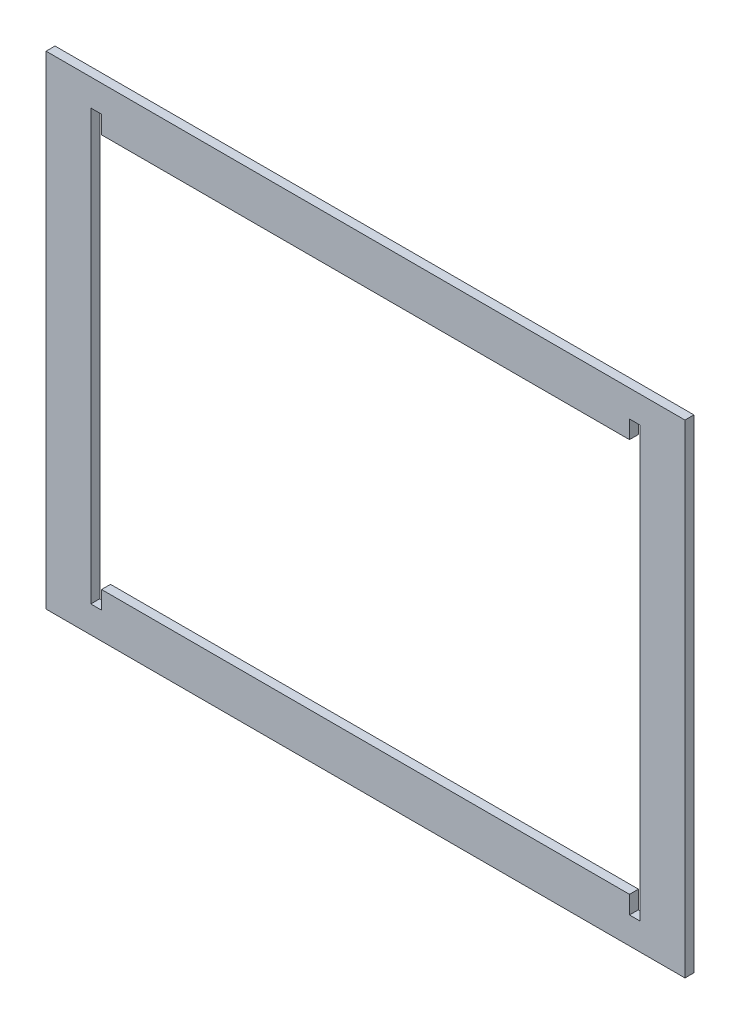
ISO-10303-21;
HEADER;
FILE_DESCRIPTION(('STEP AP214'),'2;1');
FILE_NAME('part.step','',(''),(''),'','','');
FILE_SCHEMA(('AUTOMOTIVE_DESIGN { 1 0 10303 214 1 1 1 1 }'));
ENDSEC;
DATA;
#1=APPLICATION_CONTEXT('core data for automotive mechanical design processes');
#2=APPLICATION_PROTOCOL_DEFINITION('international standard','automotive_design',2000,#1);
#3=PRODUCT_CONTEXT('',#1,'mechanical');
#4=PRODUCT('Part','Part','',(#3));
#5=PRODUCT_RELATED_PRODUCT_CATEGORY('part','',(#4));
#6=PRODUCT_DEFINITION_FORMATION('','',#4);
#7=PRODUCT_DEFINITION_CONTEXT('part definition',#1,'design');
#8=PRODUCT_DEFINITION('design','',#6,#7);
#9=PRODUCT_DEFINITION_SHAPE('','',#8);
#10=(LENGTH_UNIT() NAMED_UNIT(*) SI_UNIT(.MILLI.,.METRE.));
#11=(NAMED_UNIT(*) PLANE_ANGLE_UNIT() SI_UNIT($,.RADIAN.));
#12=(NAMED_UNIT(*) SI_UNIT($,.STERADIAN.) SOLID_ANGLE_UNIT());
#13=UNCERTAINTY_MEASURE_WITH_UNIT(LENGTH_MEASURE(1.E-05),#10,'distance_accuracy_value','');
#14=(GEOMETRIC_REPRESENTATION_CONTEXT(3) GLOBAL_UNCERTAINTY_ASSIGNED_CONTEXT((#13)) GLOBAL_UNIT_ASSIGNED_CONTEXT((#10,
#11,#12)) REPRESENTATION_CONTEXT('',''));
#15=CARTESIAN_POINT('',(0.,0.,0.));
#16=DIRECTION('',(0.,0.,1.));
#17=DIRECTION('',(1.,0.,0.));
#18=AXIS2_PLACEMENT_3D('',#15,#16,#17);
#19=CARTESIAN_POINT('',(178.5,135.,5.));
#20=DIRECTION('',(0.,0.,-1.));
#21=DIRECTION('',(-1.,0.,0.));
#22=AXIS2_PLACEMENT_3D('',#19,#20,#21);
#23=PLANE('',#22);
#24=DIRECTION('',(0.,1.,0.));
#25=VECTOR('',#24,1.);
#26=CARTESIAN_POINT('',(178.5,-135.,5.));
#27=LINE('',#26,#25);
#28=CARTESIAN_POINT('',(178.5,-135.,5.));
#29=VERTEX_POINT('',#28);
#30=CARTESIAN_POINT('',(178.5,135.,5.));
#31=VERTEX_POINT('',#30);
#32=EDGE_CURVE('E257',#29,#31,#27,.T.);
#33=ORIENTED_EDGE('',*,*,#32,.T.);
#34=DIRECTION('',(-1.,0.,0.));
#35=VECTOR('',#34,1.);
#36=CARTESIAN_POINT('',(-178.5,135.,5.));
#37=LINE('',#36,#35);
#38=CARTESIAN_POINT('',(-178.5,135.,5.));
#39=VERTEX_POINT('',#38);
#40=EDGE_CURVE('E83',#31,#39,#37,.T.);
#41=ORIENTED_EDGE('',*,*,#40,.T.);
#42=DIRECTION('',(0.,-1.,0.));
#43=VECTOR('',#42,1.);
#44=CARTESIAN_POINT('',(-178.5,-135.,5.));
#45=LINE('',#44,#43);
#46=CARTESIAN_POINT('',(-178.5,-135.,5.));
#47=VERTEX_POINT('',#46);
#48=EDGE_CURVE('E260',#39,#47,#45,.T.);
#49=ORIENTED_EDGE('',*,*,#48,.T.);
#50=DIRECTION('',(1.,0.,0.));
#51=VECTOR('',#50,1.);
#52=CARTESIAN_POINT('',(-178.5,-135.,5.));
#53=LINE('',#52,#51);
#54=EDGE_CURVE('E55',#47,#29,#53,.T.);
#55=ORIENTED_EDGE('',*,*,#54,.T.);
#56=EDGE_LOOP('',(#33,#41,#49,#55));
#57=FACE_BOUND('',#56,.T.);
#58=DIRECTION('',(1.,0.,0.));
#59=VECTOR('',#58,1.);
#60=CARTESIAN_POINT('',(-153.5,-120.,5.));
#61=LINE('',#60,#59);
#62=CARTESIAN_POINT('',(-153.5,-120.,5.));
#63=VERTEX_POINT('',#62);
#64=CARTESIAN_POINT('',(-147.5,-120.,5.));
#65=VERTEX_POINT('',#64);
#66=EDGE_CURVE('E183',#63,#65,#61,.T.);
#67=ORIENTED_EDGE('',*,*,#66,.F.);
#68=DIRECTION('',(0.,-1.,0.));
#69=VECTOR('',#68,1.);
#70=CARTESIAN_POINT('',(-153.5,-110.,5.));
#71=LINE('',#70,#69);
#72=CARTESIAN_POINT('',(-153.5,120.,5.));
#73=VERTEX_POINT('',#72);
#74=EDGE_CURVE('E172',#73,#63,#71,.T.);
#75=ORIENTED_EDGE('',*,*,#74,.F.);
#76=DIRECTION('',(-1.,0.,0.));
#77=VECTOR('',#76,1.);
#78=CARTESIAN_POINT('',(-153.5,120.,5.));
#79=LINE('',#78,#77);
#80=CARTESIAN_POINT('',(-147.5,120.,5.));
#81=VERTEX_POINT('',#80);
#82=EDGE_CURVE('E232',#81,#73,#79,.T.);
#83=ORIENTED_EDGE('',*,*,#82,.F.);
#84=DIRECTION('',(0.,1.,0.));
#85=VECTOR('',#84,1.);
#86=CARTESIAN_POINT('',(-147.5,110.,5.));
#87=LINE('',#86,#85);
#88=CARTESIAN_POINT('',(-147.5,110.,5.));
#89=VERTEX_POINT('',#88);
#90=EDGE_CURVE('E224',#89,#81,#87,.T.);
#91=ORIENTED_EDGE('',*,*,#90,.F.);
#92=DIRECTION('',(-1.,0.,0.));
#93=VECTOR('',#92,1.);
#94=CARTESIAN_POINT('',(-153.5,110.,5.));
#95=LINE('',#94,#93);
#96=CARTESIAN_POINT('',(147.5,110.,5.));
#97=VERTEX_POINT('',#96);
#98=EDGE_CURVE('E248',#97,#89,#95,.T.);
#99=ORIENTED_EDGE('',*,*,#98,.F.);
#100=DIRECTION('',(0.,-1.,0.));
#101=VECTOR('',#100,1.);
#102=CARTESIAN_POINT('',(147.5,110.,5.));
#103=LINE('',#102,#101);
#104=CARTESIAN_POINT('',(147.5,120.,5.));
#105=VERTEX_POINT('',#104);
#106=EDGE_CURVE('E206',#105,#97,#103,.T.);
#107=ORIENTED_EDGE('',*,*,#106,.F.);
#108=DIRECTION('',(-1.,0.,0.));
#109=VECTOR('',#108,1.);
#110=CARTESIAN_POINT('',(147.5,120.,5.));
#111=LINE('',#110,#109);
#112=CARTESIAN_POINT('',(153.5,120.,5.));
#113=VERTEX_POINT('',#112);
#114=EDGE_CURVE('E215',#113,#105,#111,.T.);
#115=ORIENTED_EDGE('',*,*,#114,.F.);
#116=DIRECTION('',(0.,1.,0.));
#117=VECTOR('',#116,1.);
#118=CARTESIAN_POINT('',(153.5,-110.,5.));
#119=LINE('',#118,#117);
#120=CARTESIAN_POINT('',(153.5,-120.,5.));
#121=VERTEX_POINT('',#120);
#122=EDGE_CURVE('E246',#121,#113,#119,.T.);
#123=ORIENTED_EDGE('',*,*,#122,.F.);
#124=DIRECTION('',(1.,0.,0.));
#125=VECTOR('',#124,1.);
#126=CARTESIAN_POINT('',(147.5,-120.,5.));
#127=LINE('',#126,#125);
#128=CARTESIAN_POINT('',(147.5,-120.,5.));
#129=VERTEX_POINT('',#128);
#130=EDGE_CURVE('E195',#129,#121,#127,.T.);
#131=ORIENTED_EDGE('',*,*,#130,.F.);
#132=DIRECTION('',(0.,-1.,0.));
#133=VECTOR('',#132,1.);
#134=CARTESIAN_POINT('',(147.5,-110.,5.));
#135=LINE('',#134,#133);
#136=CARTESIAN_POINT('',(147.5,-110.,5.));
#137=VERTEX_POINT('',#136);
#138=EDGE_CURVE('E189',#137,#129,#135,.T.);
#139=ORIENTED_EDGE('',*,*,#138,.F.);
#140=DIRECTION('',(1.,0.,0.));
#141=VECTOR('',#140,1.);
#142=CARTESIAN_POINT('',(-153.5,-110.,5.));
#143=LINE('',#142,#141);
#144=CARTESIAN_POINT('',(-147.5,-110.,5.));
#145=VERTEX_POINT('',#144);
#146=EDGE_CURVE('E251',#145,#137,#143,.T.);
#147=ORIENTED_EDGE('',*,*,#146,.F.);
#148=DIRECTION('',(0.,1.,0.));
#149=VECTOR('',#148,1.);
#150=CARTESIAN_POINT('',(-147.5,-110.,5.));
#151=LINE('',#150,#149);
#152=EDGE_CURVE('E46',#65,#145,#151,.T.);
#153=ORIENTED_EDGE('',*,*,#152,.F.);
#154=EDGE_LOOP('',(#67,#75,#83,#91,#99,#107,#115,#123,#131,#139,#147,#153));
#155=FACE_BOUND('',#154,.T.);
#156=ADVANCED_FACE('F31',(#57,#155),#23,.F.);
#157=CARTESIAN_POINT('',(178.5,135.,0.));
#158=DIRECTION('',(0.,0.,-1.));
#159=DIRECTION('',(-1.,0.,0.));
#160=AXIS2_PLACEMENT_3D('',#157,#158,#159);
#161=PLANE('',#160);
#162=DIRECTION('',(0.,-1.,0.));
#163=VECTOR('',#162,1.);
#164=CARTESIAN_POINT('',(-153.5,-110.,0.));
#165=LINE('',#164,#163);
#166=CARTESIAN_POINT('',(-153.5,120.,0.));
#167=VERTEX_POINT('',#166);
#168=CARTESIAN_POINT('',(-153.5,-120.,0.));
#169=VERTEX_POINT('',#168);
#170=EDGE_CURVE('E153',#167,#169,#165,.T.);
#171=ORIENTED_EDGE('',*,*,#170,.T.);
#172=DIRECTION('',(1.,0.,0.));
#173=VECTOR('',#172,1.);
#174=CARTESIAN_POINT('',(-153.5,-120.,0.));
#175=LINE('',#174,#173);
#176=CARTESIAN_POINT('',(-147.5,-120.,0.));
#177=VERTEX_POINT('',#176);
#178=EDGE_CURVE('E159',#169,#177,#175,.T.);
#179=ORIENTED_EDGE('',*,*,#178,.T.);
#180=DIRECTION('',(0.,1.,0.));
#181=VECTOR('',#180,1.);
#182=CARTESIAN_POINT('',(-147.5,-110.,0.));
#183=LINE('',#182,#181);
#184=CARTESIAN_POINT('',(-147.5,-110.,0.));
#185=VERTEX_POINT('',#184);
#186=EDGE_CURVE('E177',#177,#185,#183,.T.);
#187=ORIENTED_EDGE('',*,*,#186,.T.);
#188=DIRECTION('',(1.,0.,0.));
#189=VECTOR('',#188,1.);
#190=CARTESIAN_POINT('',(-153.5,-110.,0.));
#191=LINE('',#190,#189);
#192=CARTESIAN_POINT('',(147.5,-110.,0.));
#193=VERTEX_POINT('',#192);
#194=EDGE_CURVE('E166',#185,#193,#191,.T.);
#195=ORIENTED_EDGE('',*,*,#194,.T.);
#196=DIRECTION('',(0.,-1.,0.));
#197=VECTOR('',#196,1.);
#198=CARTESIAN_POINT('',(147.5,-110.,0.));
#199=LINE('',#198,#197);
#200=CARTESIAN_POINT('',(147.5,-120.,0.));
#201=VERTEX_POINT('',#200);
#202=EDGE_CURVE('E191',#193,#201,#199,.T.);
#203=ORIENTED_EDGE('',*,*,#202,.T.);
#204=DIRECTION('',(1.,0.,0.));
#205=VECTOR('',#204,1.);
#206=CARTESIAN_POINT('',(147.5,-120.,0.));
#207=LINE('',#206,#205);
#208=CARTESIAN_POINT('',(153.5,-120.,0.));
#209=VERTEX_POINT('',#208);
#210=EDGE_CURVE('E194',#201,#209,#207,.T.);
#211=ORIENTED_EDGE('',*,*,#210,.T.);
#212=DIRECTION('',(0.,1.,0.));
#213=VECTOR('',#212,1.);
#214=CARTESIAN_POINT('',(153.5,-110.,0.));
#215=LINE('',#214,#213);
#216=CARTESIAN_POINT('',(153.5,120.,0.));
#217=VERTEX_POINT('',#216);
#218=EDGE_CURVE('E241',#209,#217,#215,.T.);
#219=ORIENTED_EDGE('',*,*,#218,.T.);
#220=DIRECTION('',(-1.,0.,0.));
#221=VECTOR('',#220,1.);
#222=CARTESIAN_POINT('',(147.5,120.,0.));
#223=LINE('',#222,#221);
#224=CARTESIAN_POINT('',(147.5,120.,0.));
#225=VERTEX_POINT('',#224);
#226=EDGE_CURVE('E214',#217,#225,#223,.T.);
#227=ORIENTED_EDGE('',*,*,#226,.T.);
#228=DIRECTION('',(0.,-1.,0.));
#229=VECTOR('',#228,1.);
#230=CARTESIAN_POINT('',(147.5,110.,0.));
#231=LINE('',#230,#229);
#232=CARTESIAN_POINT('',(147.5,110.,0.));
#233=VERTEX_POINT('',#232);
#234=EDGE_CURVE('E211',#225,#233,#231,.T.);
#235=ORIENTED_EDGE('',*,*,#234,.T.);
#236=DIRECTION('',(-1.,0.,0.));
#237=VECTOR('',#236,1.);
#238=CARTESIAN_POINT('',(-153.5,110.,0.));
#239=LINE('',#238,#237);
#240=CARTESIAN_POINT('',(-147.5,110.,0.));
#241=VERTEX_POINT('',#240);
#242=EDGE_CURVE('E167',#233,#241,#239,.T.);
#243=ORIENTED_EDGE('',*,*,#242,.T.);
#244=DIRECTION('',(0.,1.,0.));
#245=VECTOR('',#244,1.);
#246=CARTESIAN_POINT('',(-147.5,110.,0.));
#247=LINE('',#246,#245);
#248=CARTESIAN_POINT('',(-147.5,120.,0.));
#249=VERTEX_POINT('',#248);
#250=EDGE_CURVE('E230',#241,#249,#247,.T.);
#251=ORIENTED_EDGE('',*,*,#250,.T.);
#252=DIRECTION('',(-1.,0.,0.));
#253=VECTOR('',#252,1.);
#254=CARTESIAN_POINT('',(-153.5,120.,0.));
#255=LINE('',#254,#253);
#256=EDGE_CURVE('E162',#249,#167,#255,.T.);
#257=ORIENTED_EDGE('',*,*,#256,.T.);
#258=EDGE_LOOP('',(#171,#179,#187,#195,#203,#211,#219,#227,#235,#243,#251,#257));
#259=FACE_BOUND('',#258,.T.);
#260=DIRECTION('',(0.,1.,0.));
#261=VECTOR('',#260,1.);
#262=CARTESIAN_POINT('',(178.5,-135.,0.));
#263=LINE('',#262,#261);
#264=CARTESIAN_POINT('',(178.5,-135.,0.));
#265=VERTEX_POINT('',#264);
#266=CARTESIAN_POINT('',(178.5,135.,0.));
#267=VERTEX_POINT('',#266);
#268=EDGE_CURVE('E253',#265,#267,#263,.T.);
#269=ORIENTED_EDGE('',*,*,#268,.F.);
#270=DIRECTION('',(1.,0.,0.));
#271=VECTOR('',#270,1.);
#272=CARTESIAN_POINT('',(-178.5,-135.,0.));
#273=LINE('',#272,#271);
#274=CARTESIAN_POINT('',(-178.5,-135.,0.));
#275=VERTEX_POINT('',#274);
#276=EDGE_CURVE('E76',#275,#265,#273,.T.);
#277=ORIENTED_EDGE('',*,*,#276,.F.);
#278=DIRECTION('',(0.,-1.,0.));
#279=VECTOR('',#278,1.);
#280=CARTESIAN_POINT('',(-178.5,-135.,0.));
#281=LINE('',#280,#279);
#282=CARTESIAN_POINT('',(-178.5,135.,0.));
#283=VERTEX_POINT('',#282);
#284=EDGE_CURVE('E268',#283,#275,#281,.T.);
#285=ORIENTED_EDGE('',*,*,#284,.F.);
#286=DIRECTION('',(-1.,0.,0.));
#287=VECTOR('',#286,1.);
#288=CARTESIAN_POINT('',(-178.5,135.,0.));
#289=LINE('',#288,#287);
#290=EDGE_CURVE('E266',#267,#283,#289,.T.);
#291=ORIENTED_EDGE('',*,*,#290,.F.);
#292=EDGE_LOOP('',(#269,#277,#285,#291));
#293=FACE_BOUND('',#292,.T.);
#294=ADVANCED_FACE('F155',(#259,#293),#161,.T.);
#295=CARTESIAN_POINT('',(178.5,-135.,5.));
#296=DIRECTION('',(-1.,0.,0.));
#297=DIRECTION('',(0.,0.,1.));
#298=AXIS2_PLACEMENT_3D('',#295,#296,#297);
#299=PLANE('',#298);
#300=ORIENTED_EDGE('',*,*,#268,.T.);
#301=DIRECTION('',(0.,0.,-1.));
#302=VECTOR('',#301,1.);
#303=CARTESIAN_POINT('',(178.5,135.,5.));
#304=LINE('',#303,#302);
#305=EDGE_CURVE('E11',#31,#267,#304,.T.);
#306=ORIENTED_EDGE('',*,*,#305,.F.);
#307=ORIENTED_EDGE('',*,*,#32,.F.);
#308=DIRECTION('',(0.,0.,-1.));
#309=VECTOR('',#308,1.);
#310=CARTESIAN_POINT('',(178.5,-135.,5.));
#311=LINE('',#310,#309);
#312=EDGE_CURVE('E263',#29,#265,#311,.T.);
#313=ORIENTED_EDGE('',*,*,#312,.T.);
#314=EDGE_LOOP('',(#300,#306,#307,#313));
#315=FACE_BOUND('',#314,.T.);
#316=ADVANCED_FACE('F33',(#315),#299,.F.);
#317=CARTESIAN_POINT('',(-178.5,135.,5.));
#318=DIRECTION('',(0.,-1.,0.));
#319=DIRECTION('',(0.,0.,-1.));
#320=AXIS2_PLACEMENT_3D('',#317,#318,#319);
#321=PLANE('',#320);
#322=ORIENTED_EDGE('',*,*,#290,.T.);
#323=DIRECTION('',(0.,0.,-1.));
#324=VECTOR('',#323,1.);
#325=CARTESIAN_POINT('',(-178.5,135.,5.));
#326=LINE('',#325,#324);
#327=EDGE_CURVE('E39',#39,#283,#326,.T.);
#328=ORIENTED_EDGE('',*,*,#327,.F.);
#329=ORIENTED_EDGE('',*,*,#40,.F.);
#330=ORIENTED_EDGE('',*,*,#305,.T.);
#331=EDGE_LOOP('',(#322,#328,#329,#330));
#332=FACE_BOUND('',#331,.T.);
#333=ADVANCED_FACE('F294',(#332),#321,.F.);
#334=CARTESIAN_POINT('',(-178.5,-135.,5.));
#335=DIRECTION('',(1.,0.,0.));
#336=DIRECTION('',(0.,0.,-1.));
#337=AXIS2_PLACEMENT_3D('',#334,#335,#336);
#338=PLANE('',#337);
#339=ORIENTED_EDGE('',*,*,#284,.T.);
#340=DIRECTION('',(0.,0.,-1.));
#341=VECTOR('',#340,1.);
#342=CARTESIAN_POINT('',(-178.5,-135.,5.));
#343=LINE('',#342,#341);
#344=EDGE_CURVE('E272',#47,#275,#343,.T.);
#345=ORIENTED_EDGE('',*,*,#344,.F.);
#346=ORIENTED_EDGE('',*,*,#48,.F.);
#347=ORIENTED_EDGE('',*,*,#327,.T.);
#348=EDGE_LOOP('',(#339,#345,#346,#347));
#349=FACE_BOUND('',#348,.T.);
#350=ADVANCED_FACE('F277',(#349),#338,.F.);
#351=CARTESIAN_POINT('',(-178.5,-135.,5.));
#352=DIRECTION('',(0.,1.,0.));
#353=DIRECTION('',(0.,0.,1.));
#354=AXIS2_PLACEMENT_3D('',#351,#352,#353);
#355=PLANE('',#354);
#356=ORIENTED_EDGE('',*,*,#276,.T.);
#357=ORIENTED_EDGE('',*,*,#312,.F.);
#358=ORIENTED_EDGE('',*,*,#54,.F.);
#359=ORIENTED_EDGE('',*,*,#344,.T.);
#360=EDGE_LOOP('',(#356,#357,#358,#359));
#361=FACE_BOUND('',#360,.T.);
#362=ADVANCED_FACE('F283',(#361),#355,.F.);
#363=CARTESIAN_POINT('',(153.5,-110.,5.));
#364=DIRECTION('',(-1.,0.,0.));
#365=DIRECTION('',(0.,0.,1.));
#366=AXIS2_PLACEMENT_3D('',#363,#364,#365);
#367=PLANE('',#366);
#368=ORIENTED_EDGE('',*,*,#218,.F.);
#369=DIRECTION('',(0.,0.,1.));
#370=VECTOR('',#369,1.);
#371=CARTESIAN_POINT('',(153.5,-120.,0.));
#372=LINE('',#371,#370);
#373=EDGE_CURVE('E207',#209,#121,#372,.T.);
#374=ORIENTED_EDGE('',*,*,#373,.T.);
#375=ORIENTED_EDGE('',*,*,#122,.T.);
#376=DIRECTION('',(0.,0.,1.));
#377=VECTOR('',#376,1.);
#378=CARTESIAN_POINT('',(153.5,120.,0.));
#379=LINE('',#378,#377);
#380=EDGE_CURVE('E225',#217,#113,#379,.T.);
#381=ORIENTED_EDGE('',*,*,#380,.F.);
#382=EDGE_LOOP('',(#368,#374,#375,#381));
#383=FACE_BOUND('',#382,.T.);
#384=ADVANCED_FACE('F285',(#383),#367,.T.);
#385=CARTESIAN_POINT('',(-153.5,110.,5.));
#386=DIRECTION('',(0.,-1.,0.));
#387=DIRECTION('',(0.,0.,-1.));
#388=AXIS2_PLACEMENT_3D('',#385,#386,#387);
#389=PLANE('',#388);
#390=DIRECTION('',(0.,0.,1.));
#391=VECTOR('',#390,1.);
#392=CARTESIAN_POINT('',(147.5,110.,0.));
#393=LINE('',#392,#391);
#394=EDGE_CURVE('E218',#233,#97,#393,.T.);
#395=ORIENTED_EDGE('',*,*,#394,.T.);
#396=ORIENTED_EDGE('',*,*,#98,.T.);
#397=DIRECTION('',(0.,0.,1.));
#398=VECTOR('',#397,1.);
#399=CARTESIAN_POINT('',(-147.5,110.,0.));
#400=LINE('',#399,#398);
#401=EDGE_CURVE('E234',#241,#89,#400,.T.);
#402=ORIENTED_EDGE('',*,*,#401,.F.);
#403=ORIENTED_EDGE('',*,*,#242,.F.);
#404=EDGE_LOOP('',(#395,#396,#402,#403));
#405=FACE_BOUND('',#404,.T.);
#406=ADVANCED_FACE('F291',(#405),#389,.T.);
#407=CARTESIAN_POINT('',(-153.5,-110.,5.));
#408=DIRECTION('',(1.,0.,0.));
#409=DIRECTION('',(0.,0.,-1.));
#410=AXIS2_PLACEMENT_3D('',#407,#408,#409);
#411=PLANE('',#410);
#412=ORIENTED_EDGE('',*,*,#170,.F.);
#413=DIRECTION('',(0.,0.,1.));
#414=VECTOR('',#413,1.);
#415=CARTESIAN_POINT('',(-153.5,120.,0.));
#416=LINE('',#415,#414);
#417=EDGE_CURVE('E239',#167,#73,#416,.T.);
#418=ORIENTED_EDGE('',*,*,#417,.T.);
#419=ORIENTED_EDGE('',*,*,#74,.T.);
#420=DIRECTION('',(0.,0.,1.));
#421=VECTOR('',#420,1.);
#422=CARTESIAN_POINT('',(-153.5,-120.,0.));
#423=LINE('',#422,#421);
#424=EDGE_CURVE('E170',#169,#63,#423,.T.);
#425=ORIENTED_EDGE('',*,*,#424,.F.);
#426=EDGE_LOOP('',(#412,#418,#419,#425));
#427=FACE_BOUND('',#426,.T.);
#428=ADVANCED_FACE('F171',(#427),#411,.T.);
#429=CARTESIAN_POINT('',(-153.5,-110.,5.));
#430=DIRECTION('',(0.,1.,0.));
#431=DIRECTION('',(0.,0.,1.));
#432=AXIS2_PLACEMENT_3D('',#429,#430,#431);
#433=PLANE('',#432);
#434=DIRECTION('',(0.,0.,1.));
#435=VECTOR('',#434,1.);
#436=CARTESIAN_POINT('',(-147.5,-110.,0.));
#437=LINE('',#436,#435);
#438=EDGE_CURVE('E187',#185,#145,#437,.T.);
#439=ORIENTED_EDGE('',*,*,#438,.T.);
#440=ORIENTED_EDGE('',*,*,#146,.T.);
#441=DIRECTION('',(0.,0.,1.));
#442=VECTOR('',#441,1.);
#443=CARTESIAN_POINT('',(147.5,-110.,0.));
#444=LINE('',#443,#442);
#445=EDGE_CURVE('E203',#193,#137,#444,.T.);
#446=ORIENTED_EDGE('',*,*,#445,.F.);
#447=ORIENTED_EDGE('',*,*,#194,.F.);
#448=EDGE_LOOP('',(#439,#440,#446,#447));
#449=FACE_BOUND('',#448,.T.);
#450=ADVANCED_FACE('F309',(#449),#433,.T.);
#451=CARTESIAN_POINT('',(-153.5,120.,0.));
#452=DIRECTION('',(0.,1.,0.));
#453=DIRECTION('',(0.,0.,1.));
#454=AXIS2_PLACEMENT_3D('',#451,#452,#453);
#455=PLANE('',#454);
#456=ORIENTED_EDGE('',*,*,#82,.T.);
#457=ORIENTED_EDGE('',*,*,#417,.F.);
#458=ORIENTED_EDGE('',*,*,#256,.F.);
#459=DIRECTION('',(0.,0.,1.));
#460=VECTOR('',#459,1.);
#461=CARTESIAN_POINT('',(-147.5,120.,0.));
#462=LINE('',#461,#460);
#463=EDGE_CURVE('E242',#249,#81,#462,.T.);
#464=ORIENTED_EDGE('',*,*,#463,.T.);
#465=EDGE_LOOP('',(#456,#457,#458,#464));
#466=FACE_BOUND('',#465,.T.);
#467=ADVANCED_FACE('F312',(#466),#455,.F.);
#468=CARTESIAN_POINT('',(-147.5,110.,0.));
#469=DIRECTION('',(1.,0.,0.));
#470=DIRECTION('',(0.,0.,-1.));
#471=AXIS2_PLACEMENT_3D('',#468,#469,#470);
#472=PLANE('',#471);
#473=ORIENTED_EDGE('',*,*,#90,.T.);
#474=ORIENTED_EDGE('',*,*,#463,.F.);
#475=ORIENTED_EDGE('',*,*,#250,.F.);
#476=ORIENTED_EDGE('',*,*,#401,.T.);
#477=EDGE_LOOP('',(#473,#474,#475,#476));
#478=FACE_BOUND('',#477,.T.);
#479=ADVANCED_FACE('F314',(#478),#472,.F.);
#480=CARTESIAN_POINT('',(147.5,110.,0.));
#481=DIRECTION('',(-1.,0.,0.));
#482=DIRECTION('',(0.,0.,1.));
#483=AXIS2_PLACEMENT_3D('',#480,#481,#482);
#484=PLANE('',#483);
#485=ORIENTED_EDGE('',*,*,#106,.T.);
#486=ORIENTED_EDGE('',*,*,#394,.F.);
#487=ORIENTED_EDGE('',*,*,#234,.F.);
#488=DIRECTION('',(0.,0.,1.));
#489=VECTOR('',#488,1.);
#490=CARTESIAN_POINT('',(147.5,120.,0.));
#491=LINE('',#490,#489);
#492=EDGE_CURVE('E222',#225,#105,#491,.T.);
#493=ORIENTED_EDGE('',*,*,#492,.T.);
#494=EDGE_LOOP('',(#485,#486,#487,#493));
#495=FACE_BOUND('',#494,.T.);
#496=ADVANCED_FACE('F317',(#495),#484,.F.);
#497=CARTESIAN_POINT('',(147.5,120.,0.));
#498=DIRECTION('',(0.,1.,0.));
#499=DIRECTION('',(0.,0.,1.));
#500=AXIS2_PLACEMENT_3D('',#497,#498,#499);
#501=PLANE('',#500);
#502=ORIENTED_EDGE('',*,*,#114,.T.);
#503=ORIENTED_EDGE('',*,*,#492,.F.);
#504=ORIENTED_EDGE('',*,*,#226,.F.);
#505=ORIENTED_EDGE('',*,*,#380,.T.);
#506=EDGE_LOOP('',(#502,#503,#504,#505));
#507=FACE_BOUND('',#506,.T.);
#508=ADVANCED_FACE('F324',(#507),#501,.F.);
#509=CARTESIAN_POINT('',(147.5,-110.,0.));
#510=DIRECTION('',(-1.,0.,0.));
#511=DIRECTION('',(0.,-1.,0.));
#512=AXIS2_PLACEMENT_3D('',#509,#510,#511);
#513=PLANE('',#512);
#514=ORIENTED_EDGE('',*,*,#138,.T.);
#515=DIRECTION('',(0.,0.,1.));
#516=VECTOR('',#515,1.);
#517=CARTESIAN_POINT('',(147.5,-120.,0.));
#518=LINE('',#517,#516);
#519=EDGE_CURVE('E198',#201,#129,#518,.T.);
#520=ORIENTED_EDGE('',*,*,#519,.F.);
#521=ORIENTED_EDGE('',*,*,#202,.F.);
#522=ORIENTED_EDGE('',*,*,#445,.T.);
#523=EDGE_LOOP('',(#514,#520,#521,#522));
#524=FACE_BOUND('',#523,.T.);
#525=ADVANCED_FACE('F328',(#524),#513,.F.);
#526=CARTESIAN_POINT('',(147.5,-120.,0.));
#527=DIRECTION('',(0.,-1.,0.));
#528=DIRECTION('',(0.,0.,-1.));
#529=AXIS2_PLACEMENT_3D('',#526,#527,#528);
#530=PLANE('',#529);
#531=ORIENTED_EDGE('',*,*,#130,.T.);
#532=ORIENTED_EDGE('',*,*,#373,.F.);
#533=ORIENTED_EDGE('',*,*,#210,.F.);
#534=ORIENTED_EDGE('',*,*,#519,.T.);
#535=EDGE_LOOP('',(#531,#532,#533,#534));
#536=FACE_BOUND('',#535,.T.);
#537=ADVANCED_FACE('F332',(#536),#530,.F.);
#538=CARTESIAN_POINT('',(-147.5,-110.,0.));
#539=DIRECTION('',(1.,0.,0.));
#540=DIRECTION('',(0.,0.,-1.));
#541=AXIS2_PLACEMENT_3D('',#538,#539,#540);
#542=PLANE('',#541);
#543=ORIENTED_EDGE('',*,*,#152,.T.);
#544=ORIENTED_EDGE('',*,*,#438,.F.);
#545=ORIENTED_EDGE('',*,*,#186,.F.);
#546=DIRECTION('',(0.,0.,1.));
#547=VECTOR('',#546,1.);
#548=CARTESIAN_POINT('',(-147.5,-120.,0.));
#549=LINE('',#548,#547);
#550=EDGE_CURVE('E176',#177,#65,#549,.T.);
#551=ORIENTED_EDGE('',*,*,#550,.T.);
#552=EDGE_LOOP('',(#543,#544,#545,#551));
#553=FACE_BOUND('',#552,.T.);
#554=ADVANCED_FACE('F336',(#553),#542,.F.);
#555=CARTESIAN_POINT('',(-153.5,-120.,0.));
#556=DIRECTION('',(0.,-1.,0.));
#557=DIRECTION('',(0.,0.,-1.));
#558=AXIS2_PLACEMENT_3D('',#555,#556,#557);
#559=PLANE('',#558);
#560=ORIENTED_EDGE('',*,*,#66,.T.);
#561=ORIENTED_EDGE('',*,*,#550,.F.);
#562=ORIENTED_EDGE('',*,*,#178,.F.);
#563=ORIENTED_EDGE('',*,*,#424,.T.);
#564=EDGE_LOOP('',(#560,#561,#562,#563));
#565=FACE_BOUND('',#564,.T.);
#566=ADVANCED_FACE('F179',(#565),#559,.F.);
#567=CLOSED_SHELL('',(#156,#294,#316,#333,#350,#362,#384,#406,#428,#450,#467,#479,#496,#508,
#525,#537,#554,#566));
#568=MANIFOLD_SOLID_BREP('B2',#567);
#569=ADVANCED_BREP_SHAPE_REPRESENTATION('',(#18,#568),#14);
#570=SHAPE_DEFINITION_REPRESENTATION(#9,#569);
ENDSEC;
END-ISO-10303-21;
